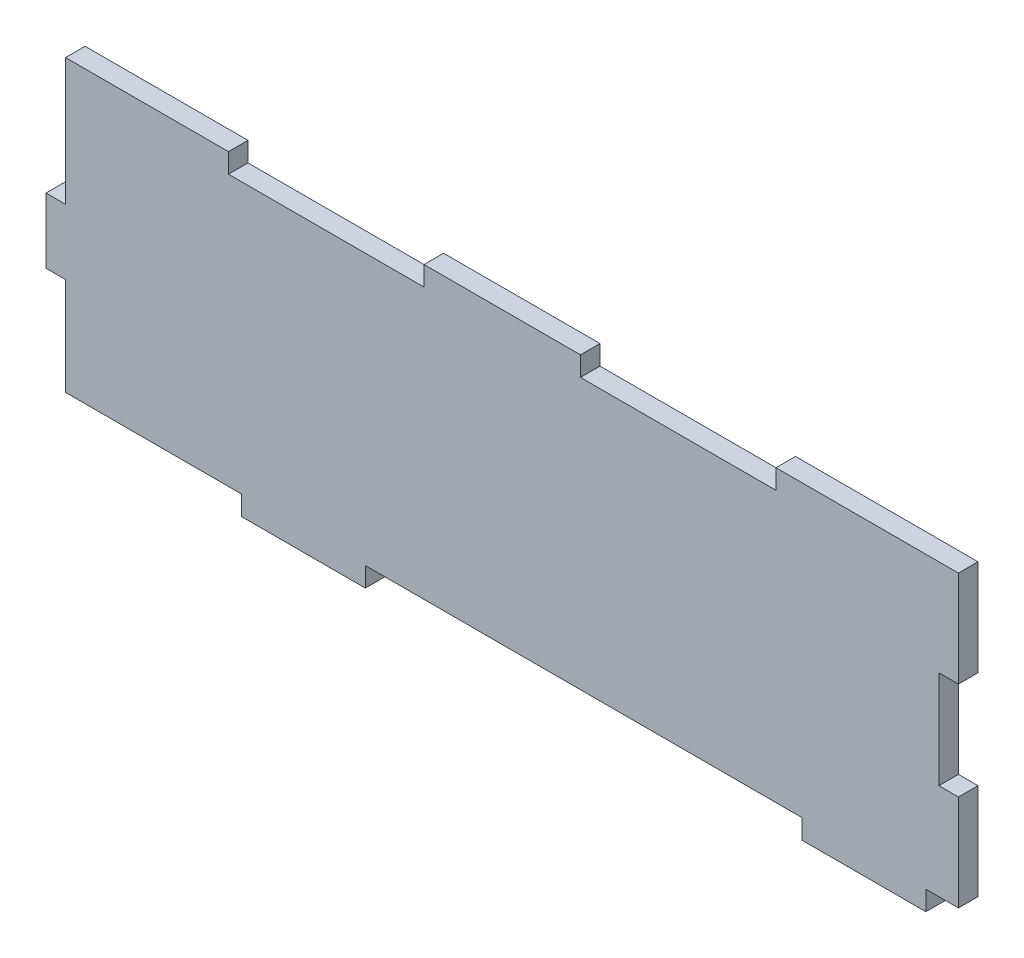
ISO-10303-21;
HEADER;
FILE_DESCRIPTION(('STEP AP214'),'2;1');
FILE_NAME('part.step','',(''),(''),'','','');
FILE_SCHEMA(('AUTOMOTIVE_DESIGN { 1 0 10303 214 1 1 1 1 }'));
ENDSEC;
DATA;
#1=APPLICATION_CONTEXT('core data for automotive mechanical design processes');
#2=APPLICATION_PROTOCOL_DEFINITION('international standard','automotive_design',2000,#1);
#3=PRODUCT_CONTEXT('',#1,'mechanical');
#4=PRODUCT('Part','Part','',(#3));
#5=PRODUCT_RELATED_PRODUCT_CATEGORY('part','',(#4));
#6=PRODUCT_DEFINITION_FORMATION('','',#4);
#7=PRODUCT_DEFINITION_CONTEXT('part definition',#1,'design');
#8=PRODUCT_DEFINITION('design','',#6,#7);
#9=PRODUCT_DEFINITION_SHAPE('','',#8);
#10=(LENGTH_UNIT() NAMED_UNIT(*) SI_UNIT(.MILLI.,.METRE.));
#11=(NAMED_UNIT(*) PLANE_ANGLE_UNIT() SI_UNIT($,.RADIAN.));
#12=(NAMED_UNIT(*) SI_UNIT($,.STERADIAN.) SOLID_ANGLE_UNIT());
#13=UNCERTAINTY_MEASURE_WITH_UNIT(LENGTH_MEASURE(1.E-05),#10,'distance_accuracy_value','');
#14=(GEOMETRIC_REPRESENTATION_CONTEXT(3) GLOBAL_UNCERTAINTY_ASSIGNED_CONTEXT((#13)) GLOBAL_UNIT_ASSIGNED_CONTEXT((#10,
#11,#12)) REPRESENTATION_CONTEXT('',''));
#15=CARTESIAN_POINT('',(0.,0.,0.));
#16=DIRECTION('',(0.,0.,1.));
#17=DIRECTION('',(1.,0.,0.));
#18=AXIS2_PLACEMENT_3D('',#15,#16,#17);
#19=CARTESIAN_POINT('',(-56.,145.,0.));
#20=DIRECTION('',(-1.,0.,0.));
#21=DIRECTION('',(0.,0.,1.));
#22=AXIS2_PLACEMENT_3D('',#19,#20,#21);
#23=PLANE('',#22);
#24=DIRECTION('',(0.,0.,-1.));
#25=VECTOR('',#24,1.);
#26=CARTESIAN_POINT('',(-56.,65.5,6.));
#27=LINE('',#26,#25);
#28=CARTESIAN_POINT('',(-56.,65.5,6.));
#29=VERTEX_POINT('',#28);
#30=CARTESIAN_POINT('',(-56.,65.5,0.));
#31=VERTEX_POINT('',#30);
#32=EDGE_CURVE('E240',#29,#31,#27,.T.);
#33=ORIENTED_EDGE('',*,*,#32,.F.);
#34=DIRECTION('',(0.,-1.,0.));
#35=VECTOR('',#34,1.);
#36=CARTESIAN_POINT('',(-56.,145.,6.));
#37=LINE('',#36,#35);
#38=CARTESIAN_POINT('',(-56.,35.5,6.));
#39=VERTEX_POINT('',#38);
#40=EDGE_CURVE('E39',#29,#39,#37,.T.);
#41=ORIENTED_EDGE('',*,*,#40,.T.);
#42=DIRECTION('',(0.,0.,1.));
#43=VECTOR('',#42,1.);
#44=CARTESIAN_POINT('',(-56.,35.5,6.));
#45=LINE('',#44,#43);
#46=CARTESIAN_POINT('',(-56.,35.5,0.));
#47=VERTEX_POINT('',#46);
#48=EDGE_CURVE('E246',#47,#39,#45,.T.);
#49=ORIENTED_EDGE('',*,*,#48,.F.);
#50=DIRECTION('',(0.,-1.,0.));
#51=VECTOR('',#50,1.);
#52=CARTESIAN_POINT('',(-56.,145.,0.));
#53=LINE('',#52,#51);
#54=EDGE_CURVE('E58',#31,#47,#53,.T.);
#55=ORIENTED_EDGE('',*,*,#54,.F.);
#56=EDGE_LOOP('',(#33,#41,#49,#55));
#57=FACE_BOUND('',#56,.T.);
#58=ADVANCED_FACE('F35',(#57),#23,.F.);
#59=CARTESIAN_POINT('',(0.,95.0000000000001,0.));
#60=DIRECTION('',(0.,1.,0.));
#61=DIRECTION('',(-1.,0.,0.));
#62=AXIS2_PLACEMENT_3D('',#59,#60,#61);
#63=PLANE('',#62);
#64=DIRECTION('',(0.,0.,1.));
#65=VECTOR('',#64,1.);
#66=CARTESIAN_POINT('',(-214.,95.,0.));
#67=LINE('',#66,#65);
#68=CARTESIAN_POINT('',(-214.,95.,0.));
#69=VERTEX_POINT('',#68);
#70=CARTESIAN_POINT('',(-214.,95.,6.));
#71=VERTEX_POINT('',#70);
#72=EDGE_CURVE('E466',#69,#71,#67,.T.);
#73=ORIENTED_EDGE('',*,*,#72,.T.);
#74=DIRECTION('',(1.,0.,0.));
#75=VECTOR('',#74,1.);
#76=CARTESIAN_POINT('',(-56.,95.,6.));
#77=LINE('',#76,#75);
#78=CARTESIAN_POINT('',(-166.,95.,6.));
#79=VERTEX_POINT('',#78);
#80=EDGE_CURVE('E300',#71,#79,#77,.T.);
#81=ORIENTED_EDGE('',*,*,#80,.T.);
#82=DIRECTION('',(0.,0.,1.));
#83=VECTOR('',#82,1.);
#84=CARTESIAN_POINT('',(-166.,95.,0.));
#85=LINE('',#84,#83);
#86=CARTESIAN_POINT('',(-166.,95.,0.));
#87=VERTEX_POINT('',#86);
#88=EDGE_CURVE('E489',#87,#79,#85,.T.);
#89=ORIENTED_EDGE('',*,*,#88,.F.);
#90=DIRECTION('',(-1.,0.,0.));
#91=VECTOR('',#90,1.);
#92=CARTESIAN_POINT('',(-56.,95.,0.));
#93=LINE('',#92,#91);
#94=EDGE_CURVE('E292',#87,#69,#93,.T.);
#95=ORIENTED_EDGE('',*,*,#94,.T.);
#96=EDGE_LOOP('',(#73,#81,#89,#95));
#97=FACE_BOUND('',#96,.T.);
#98=ADVANCED_FACE('F503',(#97),#63,.T.);
#99=DIRECTION('',(0.,0.,1.));
#100=VECTOR('',#99,1.);
#101=CARTESIAN_POINT('',(-106.,95.,0.));
#102=LINE('',#101,#100);
#103=CARTESIAN_POINT('',(-106.,95.,0.));
#104=VERTEX_POINT('',#103);
#105=CARTESIAN_POINT('',(-106.,95.,6.));
#106=VERTEX_POINT('',#105);
#107=EDGE_CURVE('E284',#104,#106,#102,.T.);
#108=ORIENTED_EDGE('',*,*,#107,.T.);
#109=CARTESIAN_POINT('',(-50.,95.,6.));
#110=VERTEX_POINT('',#109);
#111=EDGE_CURVE('E295',#106,#110,#77,.T.);
#112=ORIENTED_EDGE('',*,*,#111,.T.);
#113=DIRECTION('',(0.,0.,1.));
#114=VECTOR('',#113,1.);
#115=CARTESIAN_POINT('',(-50.,95.,6.));
#116=LINE('',#115,#114);
#117=CARTESIAN_POINT('',(-50.,95.,0.));
#118=VERTEX_POINT('',#117);
#119=EDGE_CURVE('E237',#118,#110,#116,.T.);
#120=ORIENTED_EDGE('',*,*,#119,.F.);
#121=EDGE_CURVE('E288',#118,#104,#93,.T.);
#122=ORIENTED_EDGE('',*,*,#121,.T.);
#123=EDGE_LOOP('',(#108,#112,#120,#122));
#124=FACE_BOUND('',#123,.T.);
#125=ADVANCED_FACE('F496',(#124),#63,.T.);
#126=CARTESIAN_POINT('',(0.,0.,6.));
#127=DIRECTION('',(0.,1.,0.));
#128=DIRECTION('',(0.,0.,1.));
#129=AXIS2_PLACEMENT_3D('',#126,#127,#128);
#130=PLANE('',#129);
#131=DIRECTION('',(1.,0.,0.));
#132=VECTOR('',#131,1.);
#133=CARTESIAN_POINT('',(0.,0.,0.));
#134=LINE('',#133,#132);
#135=CARTESIAN_POINT('',(-270.,0.,0.));
#136=VERTEX_POINT('',#135);
#137=CARTESIAN_POINT('',(-232.,0.,0.));
#138=VERTEX_POINT('',#137);
#139=EDGE_CURVE('E270',#136,#138,#134,.T.);
#140=ORIENTED_EDGE('',*,*,#139,.T.);
#141=DIRECTION('',(0.,0.,1.));
#142=VECTOR('',#141,1.);
#143=CARTESIAN_POINT('',(-232.,0.,0.));
#144=LINE('',#143,#142);
#145=CARTESIAN_POINT('',(-232.,0.,6.));
#146=VERTEX_POINT('',#145);
#147=EDGE_CURVE('E326',#138,#146,#144,.T.);
#148=ORIENTED_EDGE('',*,*,#147,.T.);
#149=DIRECTION('',(1.,0.,0.));
#150=VECTOR('',#149,1.);
#151=CARTESIAN_POINT('',(0.,0.,6.));
#152=LINE('',#151,#150);
#153=CARTESIAN_POINT('',(-270.,0.,6.));
#154=VERTEX_POINT('',#153);
#155=EDGE_CURVE('E11',#154,#146,#152,.T.);
#156=ORIENTED_EDGE('',*,*,#155,.F.);
#157=DIRECTION('',(0.,0.,1.));
#158=VECTOR('',#157,1.);
#159=CARTESIAN_POINT('',(-270.,0.,0.));
#160=LINE('',#159,#158);
#161=EDGE_CURVE('E371',#136,#154,#160,.T.);
#162=ORIENTED_EDGE('',*,*,#161,.F.);
#163=EDGE_LOOP('',(#140,#148,#156,#162));
#164=FACE_BOUND('',#163,.T.);
#165=ADVANCED_FACE('F407',(#164),#130,.F.);
#166=CARTESIAN_POINT('',(-330.,0.,6.));
#167=DIRECTION('',(1.,0.,0.));
#168=DIRECTION('',(0.,0.,-1.));
#169=AXIS2_PLACEMENT_3D('',#166,#167,#168);
#170=PLANE('',#169);
#171=DIRECTION('',(0.,-1.,0.));
#172=VECTOR('',#171,1.);
#173=CARTESIAN_POINT('',(-330.,0.,6.));
#174=LINE('',#173,#172);
#175=CARTESIAN_POINT('',(-330.,56.,6.));
#176=VERTEX_POINT('',#175);
#177=CARTESIAN_POINT('',(-330.,36.,6.));
#178=VERTEX_POINT('',#177);
#179=EDGE_CURVE('E393',#176,#178,#174,.T.);
#180=ORIENTED_EDGE('',*,*,#179,.F.);
#181=DIRECTION('',(0.,0.,1.));
#182=VECTOR('',#181,1.);
#183=CARTESIAN_POINT('',(-330.,56.,0.));
#184=LINE('',#183,#182);
#185=CARTESIAN_POINT('',(-330.,56.,0.));
#186=VERTEX_POINT('',#185);
#187=EDGE_CURVE('E308',#186,#176,#184,.T.);
#188=ORIENTED_EDGE('',*,*,#187,.F.);
#189=DIRECTION('',(0.,-1.,0.));
#190=VECTOR('',#189,1.);
#191=CARTESIAN_POINT('',(-330.,0.,0.));
#192=LINE('',#191,#190);
#193=CARTESIAN_POINT('',(-330.,36.,0.));
#194=VERTEX_POINT('',#193);
#195=EDGE_CURVE('E385',#186,#194,#192,.T.);
#196=ORIENTED_EDGE('',*,*,#195,.T.);
#197=DIRECTION('',(0.,0.,1.));
#198=VECTOR('',#197,1.);
#199=CARTESIAN_POINT('',(-330.,36.,0.));
#200=LINE('',#199,#198);
#201=EDGE_CURVE('E382',#194,#178,#200,.T.);
#202=ORIENTED_EDGE('',*,*,#201,.T.);
#203=EDGE_LOOP('',(#180,#188,#196,#202));
#204=FACE_BOUND('',#203,.T.);
#205=ADVANCED_FACE('F37',(#204),#170,.F.);
#206=CARTESIAN_POINT('',(-98.,0.,6.));
#207=VERTEX_POINT('',#206);
#208=CARTESIAN_POINT('',(-60.,0.,6.));
#209=VERTEX_POINT('',#208);
#210=EDGE_CURVE('E45',#207,#209,#152,.T.);
#211=ORIENTED_EDGE('',*,*,#210,.F.);
#212=DIRECTION('',(0.,0.,1.));
#213=VECTOR('',#212,1.);
#214=CARTESIAN_POINT('',(-98.,0.,0.));
#215=LINE('',#214,#213);
#216=CARTESIAN_POINT('',(-98.,0.,0.));
#217=VERTEX_POINT('',#216);
#218=EDGE_CURVE('E338',#217,#207,#215,.T.);
#219=ORIENTED_EDGE('',*,*,#218,.F.);
#220=CARTESIAN_POINT('',(-60.,0.,0.));
#221=VERTEX_POINT('',#220);
#222=EDGE_CURVE('E394',#217,#221,#134,.T.);
#223=ORIENTED_EDGE('',*,*,#222,.T.);
#224=DIRECTION('',(0.,0.,1.));
#225=VECTOR('',#224,1.);
#226=CARTESIAN_POINT('',(-60.,0.,0.));
#227=LINE('',#226,#225);
#228=EDGE_CURVE('E352',#221,#209,#227,.T.);
#229=ORIENTED_EDGE('',*,*,#228,.T.);
#230=EDGE_LOOP('',(#211,#219,#223,#229));
#231=FACE_BOUND('',#230,.T.);
#232=ADVANCED_FACE('F574',(#231),#130,.F.);
#233=CARTESIAN_POINT('',(0.,0.,6.));
#234=DIRECTION('',(0.,0.,1.));
#235=DIRECTION('',(1.,0.,0.));
#236=AXIS2_PLACEMENT_3D('',#233,#234,#235);
#237=PLANE('',#236);
#238=DIRECTION('',(0.,1.,0.));
#239=VECTOR('',#238,1.);
#240=CARTESIAN_POINT('',(-214.,95.,6.));
#241=LINE('',#240,#239);
#242=CARTESIAN_POINT('',(-214.,89.,6.));
#243=VERTEX_POINT('',#242);
#244=EDGE_CURVE('E278',#243,#71,#241,.T.);
#245=ORIENTED_EDGE('',*,*,#244,.F.);
#246=DIRECTION('',(1.,0.,0.));
#247=VECTOR('',#246,1.);
#248=CARTESIAN_POINT('',(-214.,89.,6.));
#249=LINE('',#248,#247);
#250=CARTESIAN_POINT('',(-274.,89.,6.));
#251=VERTEX_POINT('',#250);
#252=EDGE_CURVE('E452',#251,#243,#249,.T.);
#253=ORIENTED_EDGE('',*,*,#252,.F.);
#254=DIRECTION('',(0.,-1.,0.));
#255=VECTOR('',#254,1.);
#256=CARTESIAN_POINT('',(-274.,95.,6.));
#257=LINE('',#256,#255);
#258=CARTESIAN_POINT('',(-274.,95.,6.));
#259=VERTEX_POINT('',#258);
#260=EDGE_CURVE('E450',#259,#251,#257,.T.);
#261=ORIENTED_EDGE('',*,*,#260,.F.);
#262=CARTESIAN_POINT('',(-324.,95.,6.));
#263=VERTEX_POINT('',#262);
#264=EDGE_CURVE('E296',#263,#259,#77,.T.);
#265=ORIENTED_EDGE('',*,*,#264,.F.);
#266=DIRECTION('',(0.,1.,0.));
#267=VECTOR('',#266,1.);
#268=CARTESIAN_POINT('',(-324.,75.0000000000001,6.));
#269=LINE('',#268,#267);
#270=CARTESIAN_POINT('',(-324.,56.,6.));
#271=VERTEX_POINT('',#270);
#272=EDGE_CURVE('E305',#271,#263,#269,.T.);
#273=ORIENTED_EDGE('',*,*,#272,.F.);
#274=DIRECTION('',(1.,0.,0.));
#275=VECTOR('',#274,1.);
#276=CARTESIAN_POINT('',(-330.,56.,6.));
#277=LINE('',#276,#275);
#278=EDGE_CURVE('E299',#176,#271,#277,.T.);
#279=ORIENTED_EDGE('',*,*,#278,.F.);
#280=ORIENTED_EDGE('',*,*,#179,.T.);
#281=DIRECTION('',(-1.,0.,0.));
#282=VECTOR('',#281,1.);
#283=CARTESIAN_POINT('',(-330.,36.,6.));
#284=LINE('',#283,#282);
#285=CARTESIAN_POINT('',(-324.,36.,6.));
#286=VERTEX_POINT('',#285);
#287=EDGE_CURVE('E362',#286,#178,#284,.T.);
#288=ORIENTED_EDGE('',*,*,#287,.F.);
#289=DIRECTION('',(0.,1.,0.));
#290=VECTOR('',#289,1.);
#291=CARTESIAN_POINT('',(-324.,6.,6.));
#292=LINE('',#291,#290);
#293=CARTESIAN_POINT('',(-324.,6.,6.));
#294=VERTEX_POINT('',#293);
#295=EDGE_CURVE('E377',#294,#286,#292,.T.);
#296=ORIENTED_EDGE('',*,*,#295,.F.);
#297=DIRECTION('',(-1.,0.,0.));
#298=VECTOR('',#297,1.);
#299=CARTESIAN_POINT('',(-324.,6.,6.));
#300=LINE('',#299,#298);
#301=CARTESIAN_POINT('',(-270.,6.,6.));
#302=VERTEX_POINT('',#301);
#303=EDGE_CURVE('E374',#302,#294,#300,.T.);
#304=ORIENTED_EDGE('',*,*,#303,.F.);
#305=DIRECTION('',(0.,1.,0.));
#306=VECTOR('',#305,1.);
#307=CARTESIAN_POINT('',(-270.,0.,6.));
#308=LINE('',#307,#306);
#309=EDGE_CURVE('E355',#154,#302,#308,.T.);
#310=ORIENTED_EDGE('',*,*,#309,.F.);
#311=ORIENTED_EDGE('',*,*,#155,.T.);
#312=DIRECTION('',(0.,-1.,0.));
#313=VECTOR('',#312,1.);
#314=CARTESIAN_POINT('',(-232.,0.,6.));
#315=LINE('',#314,#313);
#316=CARTESIAN_POINT('',(-232.,6.,6.));
#317=VERTEX_POINT('',#316);
#318=EDGE_CURVE('E314',#317,#146,#315,.T.);
#319=ORIENTED_EDGE('',*,*,#318,.F.);
#320=DIRECTION('',(-1.,0.,0.));
#321=VECTOR('',#320,1.);
#322=CARTESIAN_POINT('',(-232.,6.,6.));
#323=LINE('',#322,#321);
#324=CARTESIAN_POINT('',(-98.,6.,6.));
#325=VERTEX_POINT('',#324);
#326=EDGE_CURVE('E320',#325,#317,#323,.T.);
#327=ORIENTED_EDGE('',*,*,#326,.F.);
#328=DIRECTION('',(0.,1.,0.));
#329=VECTOR('',#328,1.);
#330=CARTESIAN_POINT('',(-98.,0.,6.));
#331=LINE('',#330,#329);
#332=EDGE_CURVE('E328',#207,#325,#331,.T.);
#333=ORIENTED_EDGE('',*,*,#332,.F.);
#334=ORIENTED_EDGE('',*,*,#210,.T.);
#335=DIRECTION('',(0.,-1.,0.));
#336=VECTOR('',#335,1.);
#337=CARTESIAN_POINT('',(-60.,0.,6.));
#338=LINE('',#337,#336);
#339=CARTESIAN_POINT('',(-60.,5.99999999999999,6.));
#340=VERTEX_POINT('',#339);
#341=EDGE_CURVE('E345',#340,#209,#338,.T.);
#342=ORIENTED_EDGE('',*,*,#341,.F.);
#343=DIRECTION('',(-1.,0.,0.));
#344=VECTOR('',#343,1.);
#345=CARTESIAN_POINT('',(-6.,6.,6.));
#346=LINE('',#345,#344);
#347=CARTESIAN_POINT('',(-50.,6.00000000000001,6.));
#348=VERTEX_POINT('',#347);
#349=EDGE_CURVE('E335',#348,#340,#346,.T.);
#350=ORIENTED_EDGE('',*,*,#349,.F.);
#351=DIRECTION('',(0.,-1.,0.));
#352=VECTOR('',#351,1.);
#353=CARTESIAN_POINT('',(-50.,6.00000000000001,6.));
#354=LINE('',#353,#352);
#355=CARTESIAN_POINT('',(-50.,35.5,6.));
#356=VERTEX_POINT('',#355);
#357=EDGE_CURVE('E249',#356,#348,#354,.T.);
#358=ORIENTED_EDGE('',*,*,#357,.F.);
#359=DIRECTION('',(-1.,0.,0.));
#360=VECTOR('',#359,1.);
#361=CARTESIAN_POINT('',(-50.,35.5,6.));
#362=LINE('',#361,#360);
#363=EDGE_CURVE('E263',#356,#39,#362,.T.);
#364=ORIENTED_EDGE('',*,*,#363,.T.);
#365=ORIENTED_EDGE('',*,*,#40,.F.);
#366=DIRECTION('',(-1.,0.,0.));
#367=VECTOR('',#366,1.);
#368=CARTESIAN_POINT('',(-50.,65.5,6.));
#369=LINE('',#368,#367);
#370=CARTESIAN_POINT('',(-50.,65.5,6.));
#371=VERTEX_POINT('',#370);
#372=EDGE_CURVE('E226',#371,#29,#369,.T.);
#373=ORIENTED_EDGE('',*,*,#372,.F.);
#374=DIRECTION('',(0.,-1.,0.));
#375=VECTOR('',#374,1.);
#376=CARTESIAN_POINT('',(-50.,95.,6.));
#377=LINE('',#376,#375);
#378=EDGE_CURVE('E231',#110,#371,#377,.T.);
#379=ORIENTED_EDGE('',*,*,#378,.F.);
#380=ORIENTED_EDGE('',*,*,#111,.F.);
#381=DIRECTION('',(0.,1.,0.));
#382=VECTOR('',#381,1.);
#383=CARTESIAN_POINT('',(-106.,95.,6.));
#384=LINE('',#383,#382);
#385=CARTESIAN_POINT('',(-106.,89.,6.));
#386=VERTEX_POINT('',#385);
#387=EDGE_CURVE('E461',#386,#106,#384,.T.);
#388=ORIENTED_EDGE('',*,*,#387,.F.);
#389=DIRECTION('',(1.,0.,0.));
#390=VECTOR('',#389,1.);
#391=CARTESIAN_POINT('',(-106.,89.,6.));
#392=LINE('',#391,#390);
#393=CARTESIAN_POINT('',(-166.,89.,6.));
#394=VERTEX_POINT('',#393);
#395=EDGE_CURVE('E474',#394,#386,#392,.T.);
#396=ORIENTED_EDGE('',*,*,#395,.F.);
#397=DIRECTION('',(0.,-1.,0.));
#398=VECTOR('',#397,1.);
#399=CARTESIAN_POINT('',(-166.,95.,6.));
#400=LINE('',#399,#398);
#401=EDGE_CURVE('E481',#79,#394,#400,.T.);
#402=ORIENTED_EDGE('',*,*,#401,.F.);
#403=ORIENTED_EDGE('',*,*,#80,.F.);
#404=EDGE_LOOP('',(#245,#253,#261,#265,#273,#279,#280,#288,#296,#304,#310,#311,#319,#327,#333,
#334,#342,#350,#358,#364,#365,#373,#379,#380,#388,#396,#402,#403));
#405=FACE_BOUND('',#404,.T.);
#406=ADVANCED_FACE('F244',(#405),#237,.T.);
#407=CARTESIAN_POINT('',(0.,0.,0.));
#408=DIRECTION('',(0.,0.,1.));
#409=DIRECTION('',(1.,0.,0.));
#410=AXIS2_PLACEMENT_3D('',#407,#408,#409);
#411=PLANE('',#410);
#412=DIRECTION('',(1.,0.,0.));
#413=VECTOR('',#412,1.);
#414=CARTESIAN_POINT('',(-214.,89.,0.));
#415=LINE('',#414,#413);
#416=CARTESIAN_POINT('',(-274.,89.,0.));
#417=VERTEX_POINT('',#416);
#418=CARTESIAN_POINT('',(-214.,89.,0.));
#419=VERTEX_POINT('',#418);
#420=EDGE_CURVE('E469',#417,#419,#415,.T.);
#421=ORIENTED_EDGE('',*,*,#420,.T.);
#422=DIRECTION('',(0.,1.,0.));
#423=VECTOR('',#422,1.);
#424=CARTESIAN_POINT('',(-214.,95.,0.));
#425=LINE('',#424,#423);
#426=EDGE_CURVE('E266',#419,#69,#425,.T.);
#427=ORIENTED_EDGE('',*,*,#426,.T.);
#428=ORIENTED_EDGE('',*,*,#94,.F.);
#429=DIRECTION('',(0.,-1.,0.));
#430=VECTOR('',#429,1.);
#431=CARTESIAN_POINT('',(-166.,95.,0.));
#432=LINE('',#431,#430);
#433=CARTESIAN_POINT('',(-166.,89.,0.));
#434=VERTEX_POINT('',#433);
#435=EDGE_CURVE('E473',#87,#434,#432,.T.);
#436=ORIENTED_EDGE('',*,*,#435,.T.);
#437=DIRECTION('',(1.,0.,0.));
#438=VECTOR('',#437,1.);
#439=CARTESIAN_POINT('',(-106.,89.,0.));
#440=LINE('',#439,#438);
#441=CARTESIAN_POINT('',(-106.,89.,0.));
#442=VERTEX_POINT('',#441);
#443=EDGE_CURVE('E477',#434,#442,#440,.T.);
#444=ORIENTED_EDGE('',*,*,#443,.T.);
#445=DIRECTION('',(0.,1.,0.));
#446=VECTOR('',#445,1.);
#447=CARTESIAN_POINT('',(-106.,95.,0.));
#448=LINE('',#447,#446);
#449=EDGE_CURVE('E470',#442,#104,#448,.T.);
#450=ORIENTED_EDGE('',*,*,#449,.T.);
#451=ORIENTED_EDGE('',*,*,#121,.F.);
#452=DIRECTION('',(0.,1.,0.));
#453=VECTOR('',#452,1.);
#454=CARTESIAN_POINT('',(-50.,95.,0.));
#455=LINE('',#454,#453);
#456=CARTESIAN_POINT('',(-50.,65.5,0.));
#457=VERTEX_POINT('',#456);
#458=EDGE_CURVE('E230',#457,#118,#455,.T.);
#459=ORIENTED_EDGE('',*,*,#458,.F.);
#460=DIRECTION('',(-1.,0.,0.));
#461=VECTOR('',#460,1.);
#462=CARTESIAN_POINT('',(-50.,65.5,0.));
#463=LINE('',#462,#461);
#464=EDGE_CURVE('E53',#457,#31,#463,.T.);
#465=ORIENTED_EDGE('',*,*,#464,.T.);
#466=ORIENTED_EDGE('',*,*,#54,.T.);
#467=DIRECTION('',(-1.,0.,0.));
#468=VECTOR('',#467,1.);
#469=CARTESIAN_POINT('',(-50.,35.5,0.));
#470=LINE('',#469,#468);
#471=CARTESIAN_POINT('',(-50.,35.5,0.));
#472=VERTEX_POINT('',#471);
#473=EDGE_CURVE('E273',#472,#47,#470,.T.);
#474=ORIENTED_EDGE('',*,*,#473,.F.);
#475=DIRECTION('',(0.,1.,0.));
#476=VECTOR('',#475,1.);
#477=CARTESIAN_POINT('',(-50.,6.00000000000001,0.));
#478=LINE('',#477,#476);
#479=CARTESIAN_POINT('',(-50.,6.00000000000001,0.));
#480=VERTEX_POINT('',#479);
#481=EDGE_CURVE('E259',#480,#472,#478,.T.);
#482=ORIENTED_EDGE('',*,*,#481,.F.);
#483=DIRECTION('',(-1.,0.,0.));
#484=VECTOR('',#483,1.);
#485=CARTESIAN_POINT('',(-6.,6.,0.));
#486=LINE('',#485,#484);
#487=CARTESIAN_POINT('',(-60.,5.99999999999999,0.));
#488=VERTEX_POINT('',#487);
#489=EDGE_CURVE('E342',#480,#488,#486,.T.);
#490=ORIENTED_EDGE('',*,*,#489,.T.);
#491=DIRECTION('',(0.,-1.,0.));
#492=VECTOR('',#491,1.);
#493=CARTESIAN_POINT('',(-60.,0.,0.));
#494=LINE('',#493,#492);
#495=EDGE_CURVE('E344',#488,#221,#494,.T.);
#496=ORIENTED_EDGE('',*,*,#495,.T.);
#497=ORIENTED_EDGE('',*,*,#222,.F.);
#498=DIRECTION('',(0.,1.,0.));
#499=VECTOR('',#498,1.);
#500=CARTESIAN_POINT('',(-98.,0.,0.));
#501=LINE('',#500,#499);
#502=CARTESIAN_POINT('',(-98.,6.,0.));
#503=VERTEX_POINT('',#502);
#504=EDGE_CURVE('E319',#217,#503,#501,.T.);
#505=ORIENTED_EDGE('',*,*,#504,.T.);
#506=DIRECTION('',(-1.,0.,0.));
#507=VECTOR('',#506,1.);
#508=CARTESIAN_POINT('',(-232.,6.,0.));
#509=LINE('',#508,#507);
#510=CARTESIAN_POINT('',(-232.,6.,0.));
#511=VERTEX_POINT('',#510);
#512=EDGE_CURVE('E323',#503,#511,#509,.T.);
#513=ORIENTED_EDGE('',*,*,#512,.T.);
#514=DIRECTION('',(0.,-1.,0.));
#515=VECTOR('',#514,1.);
#516=CARTESIAN_POINT('',(-232.,0.,0.));
#517=LINE('',#516,#515);
#518=EDGE_CURVE('E316',#511,#138,#517,.T.);
#519=ORIENTED_EDGE('',*,*,#518,.T.);
#520=ORIENTED_EDGE('',*,*,#139,.F.);
#521=DIRECTION('',(0.,1.,0.));
#522=VECTOR('',#521,1.);
#523=CARTESIAN_POINT('',(-270.,0.,0.));
#524=LINE('',#523,#522);
#525=CARTESIAN_POINT('',(-270.,6.,0.));
#526=VERTEX_POINT('',#525);
#527=EDGE_CURVE('E358',#136,#526,#524,.T.);
#528=ORIENTED_EDGE('',*,*,#527,.T.);
#529=DIRECTION('',(-1.,0.,0.));
#530=VECTOR('',#529,1.);
#531=CARTESIAN_POINT('',(-324.,6.,0.));
#532=LINE('',#531,#530);
#533=CARTESIAN_POINT('',(-324.,6.,0.));
#534=VERTEX_POINT('',#533);
#535=EDGE_CURVE('E361',#526,#534,#532,.T.);
#536=ORIENTED_EDGE('',*,*,#535,.T.);
#537=DIRECTION('',(0.,1.,0.));
#538=VECTOR('',#537,1.);
#539=CARTESIAN_POINT('',(-324.,6.,0.));
#540=LINE('',#539,#538);
#541=CARTESIAN_POINT('',(-324.,36.,0.));
#542=VERTEX_POINT('',#541);
#543=EDGE_CURVE('E365',#534,#542,#540,.T.);
#544=ORIENTED_EDGE('',*,*,#543,.T.);
#545=DIRECTION('',(-1.,0.,0.));
#546=VECTOR('',#545,1.);
#547=CARTESIAN_POINT('',(-330.,36.,0.));
#548=LINE('',#547,#546);
#549=EDGE_CURVE('E368',#542,#194,#548,.T.);
#550=ORIENTED_EDGE('',*,*,#549,.T.);
#551=ORIENTED_EDGE('',*,*,#195,.F.);
#552=DIRECTION('',(1.,0.,0.));
#553=VECTOR('',#552,1.);
#554=CARTESIAN_POINT('',(-330.,56.,0.));
#555=LINE('',#554,#553);
#556=CARTESIAN_POINT('',(-324.,56.,0.));
#557=VERTEX_POINT('',#556);
#558=EDGE_CURVE('E301',#186,#557,#555,.T.);
#559=ORIENTED_EDGE('',*,*,#558,.T.);
#560=DIRECTION('',(0.,1.,0.));
#561=VECTOR('',#560,1.);
#562=CARTESIAN_POINT('',(-324.,75.0000000000001,0.));
#563=LINE('',#562,#561);
#564=CARTESIAN_POINT('',(-324.,95.,0.));
#565=VERTEX_POINT('',#564);
#566=EDGE_CURVE('E304',#557,#565,#563,.T.);
#567=ORIENTED_EDGE('',*,*,#566,.T.);
#568=CARTESIAN_POINT('',(-274.,95.,0.));
#569=VERTEX_POINT('',#568);
#570=EDGE_CURVE('E281',#569,#565,#93,.T.);
#571=ORIENTED_EDGE('',*,*,#570,.F.);
#572=DIRECTION('',(0.,-1.,0.));
#573=VECTOR('',#572,1.);
#574=CARTESIAN_POINT('',(-274.,95.,0.));
#575=LINE('',#574,#573);
#576=EDGE_CURVE('E514',#569,#417,#575,.T.);
#577=ORIENTED_EDGE('',*,*,#576,.T.);
#578=EDGE_LOOP('',(#421,#427,#428,#436,#444,#450,#451,#459,#465,#466,#474,#482,#490,#496,#497,
#505,#513,#519,#520,#528,#536,#544,#550,#551,#559,#567,#571,#577));
#579=FACE_BOUND('',#578,.T.);
#580=ADVANCED_FACE('F410',(#579),#411,.F.);
#581=CARTESIAN_POINT('',(-330.,36.,0.));
#582=DIRECTION('',(0.,1.,0.));
#583=DIRECTION('',(0.,0.,1.));
#584=AXIS2_PLACEMENT_3D('',#581,#582,#583);
#585=PLANE('',#584);
#586=ORIENTED_EDGE('',*,*,#287,.T.);
#587=ORIENTED_EDGE('',*,*,#201,.F.);
#588=ORIENTED_EDGE('',*,*,#549,.F.);
#589=DIRECTION('',(0.,0.,1.));
#590=VECTOR('',#589,1.);
#591=CARTESIAN_POINT('',(-324.,36.,0.));
#592=LINE('',#591,#590);
#593=EDGE_CURVE('E386',#542,#286,#592,.T.);
#594=ORIENTED_EDGE('',*,*,#593,.T.);
#595=EDGE_LOOP('',(#586,#587,#588,#594));
#596=FACE_BOUND('',#595,.T.);
#597=ADVANCED_FACE('F431',(#596),#585,.F.);
#598=CARTESIAN_POINT('',(-324.,6.,0.));
#599=DIRECTION('',(1.,0.,0.));
#600=DIRECTION('',(0.,0.,-1.));
#601=AXIS2_PLACEMENT_3D('',#598,#599,#600);
#602=PLANE('',#601);
#603=ORIENTED_EDGE('',*,*,#295,.T.);
#604=ORIENTED_EDGE('',*,*,#593,.F.);
#605=ORIENTED_EDGE('',*,*,#543,.F.);
#606=DIRECTION('',(0.,0.,1.));
#607=VECTOR('',#606,1.);
#608=CARTESIAN_POINT('',(-324.,6.,0.));
#609=LINE('',#608,#607);
#610=EDGE_CURVE('E388',#534,#294,#609,.T.);
#611=ORIENTED_EDGE('',*,*,#610,.T.);
#612=EDGE_LOOP('',(#603,#604,#605,#611));
#613=FACE_BOUND('',#612,.T.);
#614=ADVANCED_FACE('F428',(#613),#602,.F.);
#615=CARTESIAN_POINT('',(-324.,6.,0.));
#616=DIRECTION('',(0.,1.,0.));
#617=DIRECTION('',(0.,0.,1.));
#618=AXIS2_PLACEMENT_3D('',#615,#616,#617);
#619=PLANE('',#618);
#620=ORIENTED_EDGE('',*,*,#303,.T.);
#621=ORIENTED_EDGE('',*,*,#610,.F.);
#622=ORIENTED_EDGE('',*,*,#535,.F.);
#623=DIRECTION('',(0.,0.,1.));
#624=VECTOR('',#623,1.);
#625=CARTESIAN_POINT('',(-270.,6.,0.));
#626=LINE('',#625,#624);
#627=EDGE_CURVE('E390',#526,#302,#626,.T.);
#628=ORIENTED_EDGE('',*,*,#627,.T.);
#629=EDGE_LOOP('',(#620,#621,#622,#628));
#630=FACE_BOUND('',#629,.T.);
#631=ADVANCED_FACE('F424',(#630),#619,.F.);
#632=CARTESIAN_POINT('',(-270.,0.,0.));
#633=DIRECTION('',(1.,0.,0.));
#634=DIRECTION('',(0.,0.,-1.));
#635=AXIS2_PLACEMENT_3D('',#632,#633,#634);
#636=PLANE('',#635);
#637=ORIENTED_EDGE('',*,*,#309,.T.);
#638=ORIENTED_EDGE('',*,*,#627,.F.);
#639=ORIENTED_EDGE('',*,*,#527,.F.);
#640=ORIENTED_EDGE('',*,*,#161,.T.);
#641=EDGE_LOOP('',(#637,#638,#639,#640));
#642=FACE_BOUND('',#641,.T.);
#643=ADVANCED_FACE('F422',(#642),#636,.F.);
#644=CARTESIAN_POINT('',(-60.,0.,0.));
#645=DIRECTION('',(-1.,0.,0.));
#646=DIRECTION('',(0.,0.,1.));
#647=AXIS2_PLACEMENT_3D('',#644,#645,#646);
#648=PLANE('',#647);
#649=ORIENTED_EDGE('',*,*,#341,.T.);
#650=ORIENTED_EDGE('',*,*,#228,.F.);
#651=ORIENTED_EDGE('',*,*,#495,.F.);
#652=DIRECTION('',(0.,0.,1.));
#653=VECTOR('',#652,1.);
#654=CARTESIAN_POINT('',(-60.,5.99999999999999,0.));
#655=LINE('',#654,#653);
#656=EDGE_CURVE('E348',#488,#340,#655,.T.);
#657=ORIENTED_EDGE('',*,*,#656,.T.);
#658=EDGE_LOOP('',(#649,#650,#651,#657));
#659=FACE_BOUND('',#658,.T.);
#660=ADVANCED_FACE('F557',(#659),#648,.F.);
#661=CARTESIAN_POINT('',(-6.,6.,0.));
#662=DIRECTION('',(0.,1.,0.));
#663=DIRECTION('',(-1.,0.,0.));
#664=AXIS2_PLACEMENT_3D('',#661,#662,#663);
#665=PLANE('',#664);
#666=ORIENTED_EDGE('',*,*,#489,.F.);
#667=DIRECTION('',(0.,0.,-1.));
#668=VECTOR('',#667,1.);
#669=CARTESIAN_POINT('',(-50.,6.00000000000001,6.));
#670=LINE('',#669,#668);
#671=EDGE_CURVE('E256',#348,#480,#670,.T.);
#672=ORIENTED_EDGE('',*,*,#671,.F.);
#673=ORIENTED_EDGE('',*,*,#349,.T.);
#674=ORIENTED_EDGE('',*,*,#656,.F.);
#675=EDGE_LOOP('',(#666,#672,#673,#674));
#676=FACE_BOUND('',#675,.T.);
#677=ADVANCED_FACE('F556',(#676),#665,.F.);
#678=CARTESIAN_POINT('',(-232.,0.,0.));
#679=DIRECTION('',(-1.,0.,0.));
#680=DIRECTION('',(0.,0.,1.));
#681=AXIS2_PLACEMENT_3D('',#678,#679,#680);
#682=PLANE('',#681);
#683=ORIENTED_EDGE('',*,*,#318,.T.);
#684=ORIENTED_EDGE('',*,*,#147,.F.);
#685=ORIENTED_EDGE('',*,*,#518,.F.);
#686=DIRECTION('',(0.,0.,1.));
#687=VECTOR('',#686,1.);
#688=CARTESIAN_POINT('',(-232.,6.,0.));
#689=LINE('',#688,#687);
#690=EDGE_CURVE('E333',#511,#317,#689,.T.);
#691=ORIENTED_EDGE('',*,*,#690,.T.);
#692=EDGE_LOOP('',(#683,#684,#685,#691));
#693=FACE_BOUND('',#692,.T.);
#694=ADVANCED_FACE('F413',(#693),#682,.F.);
#695=CARTESIAN_POINT('',(-232.,6.,0.));
#696=DIRECTION('',(0.,1.,0.));
#697=DIRECTION('',(0.,0.,1.));
#698=AXIS2_PLACEMENT_3D('',#695,#696,#697);
#699=PLANE('',#698);
#700=ORIENTED_EDGE('',*,*,#326,.T.);
#701=ORIENTED_EDGE('',*,*,#690,.F.);
#702=ORIENTED_EDGE('',*,*,#512,.F.);
#703=DIRECTION('',(0.,0.,1.));
#704=VECTOR('',#703,1.);
#705=CARTESIAN_POINT('',(-98.,6.,0.));
#706=LINE('',#705,#704);
#707=EDGE_CURVE('E336',#503,#325,#706,.T.);
#708=ORIENTED_EDGE('',*,*,#707,.T.);
#709=EDGE_LOOP('',(#700,#701,#702,#708));
#710=FACE_BOUND('',#709,.T.);
#711=ADVANCED_FACE('F547',(#710),#699,.F.);
#712=CARTESIAN_POINT('',(-98.,0.,0.));
#713=DIRECTION('',(1.,0.,0.));
#714=DIRECTION('',(0.,0.,-1.));
#715=AXIS2_PLACEMENT_3D('',#712,#713,#714);
#716=PLANE('',#715);
#717=ORIENTED_EDGE('',*,*,#332,.T.);
#718=ORIENTED_EDGE('',*,*,#707,.F.);
#719=ORIENTED_EDGE('',*,*,#504,.F.);
#720=ORIENTED_EDGE('',*,*,#218,.T.);
#721=EDGE_LOOP('',(#717,#718,#719,#720));
#722=FACE_BOUND('',#721,.T.);
#723=ADVANCED_FACE('F544',(#722),#716,.F.);
#724=CARTESIAN_POINT('',(-324.,75.0000000000001,0.));
#725=DIRECTION('',(1.,0.,0.));
#726=DIRECTION('',(0.,0.,-1.));
#727=AXIS2_PLACEMENT_3D('',#724,#725,#726);
#728=PLANE('',#727);
#729=ORIENTED_EDGE('',*,*,#272,.T.);
#730=DIRECTION('',(0.,0.,1.));
#731=VECTOR('',#730,1.);
#732=CARTESIAN_POINT('',(-324.,95.,6.));
#733=LINE('',#732,#731);
#734=EDGE_CURVE('E291',#565,#263,#733,.T.);
#735=ORIENTED_EDGE('',*,*,#734,.F.);
#736=ORIENTED_EDGE('',*,*,#566,.F.);
#737=DIRECTION('',(0.,0.,1.));
#738=VECTOR('',#737,1.);
#739=CARTESIAN_POINT('',(-324.,56.,0.));
#740=LINE('',#739,#738);
#741=EDGE_CURVE('E312',#557,#271,#740,.T.);
#742=ORIENTED_EDGE('',*,*,#741,.T.);
#743=EDGE_LOOP('',(#729,#735,#736,#742));
#744=FACE_BOUND('',#743,.T.);
#745=ADVANCED_FACE('F443',(#744),#728,.F.);
#746=CARTESIAN_POINT('',(-330.,56.,0.));
#747=DIRECTION('',(0.,-1.,0.));
#748=DIRECTION('',(0.,0.,-1.));
#749=AXIS2_PLACEMENT_3D('',#746,#747,#748);
#750=PLANE('',#749);
#751=ORIENTED_EDGE('',*,*,#278,.T.);
#752=ORIENTED_EDGE('',*,*,#741,.F.);
#753=ORIENTED_EDGE('',*,*,#558,.F.);
#754=ORIENTED_EDGE('',*,*,#187,.T.);
#755=EDGE_LOOP('',(#751,#752,#753,#754));
#756=FACE_BOUND('',#755,.T.);
#757=ADVANCED_FACE('F438',(#756),#750,.F.);
#758=DIRECTION('',(0.,0.,1.));
#759=VECTOR('',#758,1.);
#760=CARTESIAN_POINT('',(-274.,95.,0.));
#761=LINE('',#760,#759);
#762=EDGE_CURVE('E464',#569,#259,#761,.T.);
#763=ORIENTED_EDGE('',*,*,#762,.F.);
#764=ORIENTED_EDGE('',*,*,#570,.T.);
#765=ORIENTED_EDGE('',*,*,#734,.T.);
#766=ORIENTED_EDGE('',*,*,#264,.T.);
#767=EDGE_LOOP('',(#763,#764,#765,#766));
#768=FACE_BOUND('',#767,.T.);
#769=ADVANCED_FACE('F446',(#768),#63,.T.);
#770=CARTESIAN_POINT('',(-106.,95.,0.));
#771=DIRECTION('',(1.,0.,0.));
#772=DIRECTION('',(0.,0.,-1.));
#773=AXIS2_PLACEMENT_3D('',#770,#771,#772);
#774=PLANE('',#773);
#775=ORIENTED_EDGE('',*,*,#387,.T.);
#776=ORIENTED_EDGE('',*,*,#107,.F.);
#777=ORIENTED_EDGE('',*,*,#449,.F.);
#778=DIRECTION('',(0.,0.,1.));
#779=VECTOR('',#778,1.);
#780=CARTESIAN_POINT('',(-106.,89.,0.));
#781=LINE('',#780,#779);
#782=EDGE_CURVE('E486',#442,#386,#781,.T.);
#783=ORIENTED_EDGE('',*,*,#782,.T.);
#784=EDGE_LOOP('',(#775,#776,#777,#783));
#785=FACE_BOUND('',#784,.T.);
#786=ADVANCED_FACE('F539',(#785),#774,.F.);
#787=CARTESIAN_POINT('',(-106.,89.,0.));
#788=DIRECTION('',(0.,-1.,0.));
#789=DIRECTION('',(1.,0.,0.));
#790=AXIS2_PLACEMENT_3D('',#787,#788,#789);
#791=PLANE('',#790);
#792=ORIENTED_EDGE('',*,*,#395,.T.);
#793=ORIENTED_EDGE('',*,*,#782,.F.);
#794=ORIENTED_EDGE('',*,*,#443,.F.);
#795=DIRECTION('',(0.,0.,1.));
#796=VECTOR('',#795,1.);
#797=CARTESIAN_POINT('',(-166.,89.,0.));
#798=LINE('',#797,#796);
#799=EDGE_CURVE('E488',#434,#394,#798,.T.);
#800=ORIENTED_EDGE('',*,*,#799,.T.);
#801=EDGE_LOOP('',(#792,#793,#794,#800));
#802=FACE_BOUND('',#801,.T.);
#803=ADVANCED_FACE('F509',(#802),#791,.F.);
#804=CARTESIAN_POINT('',(-166.,95.,0.));
#805=DIRECTION('',(-1.,0.,0.));
#806=DIRECTION('',(0.,0.,1.));
#807=AXIS2_PLACEMENT_3D('',#804,#805,#806);
#808=PLANE('',#807);
#809=ORIENTED_EDGE('',*,*,#401,.T.);
#810=ORIENTED_EDGE('',*,*,#799,.F.);
#811=ORIENTED_EDGE('',*,*,#435,.F.);
#812=ORIENTED_EDGE('',*,*,#88,.T.);
#813=EDGE_LOOP('',(#809,#810,#811,#812));
#814=FACE_BOUND('',#813,.T.);
#815=ADVANCED_FACE('F506',(#814),#808,.F.);
#816=CARTESIAN_POINT('',(-214.,95.,0.));
#817=DIRECTION('',(1.,0.,0.));
#818=DIRECTION('',(0.,0.,-1.));
#819=AXIS2_PLACEMENT_3D('',#816,#817,#818);
#820=PLANE('',#819);
#821=ORIENTED_EDGE('',*,*,#244,.T.);
#822=ORIENTED_EDGE('',*,*,#72,.F.);
#823=ORIENTED_EDGE('',*,*,#426,.F.);
#824=DIRECTION('',(0.,0.,1.));
#825=VECTOR('',#824,1.);
#826=CARTESIAN_POINT('',(-214.,89.,0.));
#827=LINE('',#826,#825);
#828=EDGE_CURVE('E459',#419,#243,#827,.T.);
#829=ORIENTED_EDGE('',*,*,#828,.T.);
#830=EDGE_LOOP('',(#821,#822,#823,#829));
#831=FACE_BOUND('',#830,.T.);
#832=ADVANCED_FACE('F518',(#831),#820,.F.);
#833=CARTESIAN_POINT('',(-214.,89.,0.));
#834=DIRECTION('',(0.,-1.,0.));
#835=DIRECTION('',(1.,0.,0.));
#836=AXIS2_PLACEMENT_3D('',#833,#834,#835);
#837=PLANE('',#836);
#838=ORIENTED_EDGE('',*,*,#252,.T.);
#839=ORIENTED_EDGE('',*,*,#828,.F.);
#840=ORIENTED_EDGE('',*,*,#420,.F.);
#841=DIRECTION('',(0.,0.,1.));
#842=VECTOR('',#841,1.);
#843=CARTESIAN_POINT('',(-274.,89.,0.));
#844=LINE('',#843,#842);
#845=EDGE_CURVE('E462',#417,#251,#844,.T.);
#846=ORIENTED_EDGE('',*,*,#845,.T.);
#847=EDGE_LOOP('',(#838,#839,#840,#846));
#848=FACE_BOUND('',#847,.T.);
#849=ADVANCED_FACE('F517',(#848),#837,.F.);
#850=CARTESIAN_POINT('',(-274.,95.,0.));
#851=DIRECTION('',(-1.,0.,0.));
#852=DIRECTION('',(0.,0.,1.));
#853=AXIS2_PLACEMENT_3D('',#850,#851,#852);
#854=PLANE('',#853);
#855=ORIENTED_EDGE('',*,*,#260,.T.);
#856=ORIENTED_EDGE('',*,*,#845,.F.);
#857=ORIENTED_EDGE('',*,*,#576,.F.);
#858=ORIENTED_EDGE('',*,*,#762,.T.);
#859=EDGE_LOOP('',(#855,#856,#857,#858));
#860=FACE_BOUND('',#859,.T.);
#861=ADVANCED_FACE('F515',(#860),#854,.F.);
#862=CARTESIAN_POINT('',(-50.,35.5,6.));
#863=DIRECTION('',(0.,-1.,0.));
#864=DIRECTION('',(0.,0.,-1.));
#865=AXIS2_PLACEMENT_3D('',#862,#863,#864);
#866=PLANE('',#865);
#867=ORIENTED_EDGE('',*,*,#48,.T.);
#868=ORIENTED_EDGE('',*,*,#363,.F.);
#869=DIRECTION('',(0.,0.,1.));
#870=VECTOR('',#869,1.);
#871=CARTESIAN_POINT('',(-50.,35.5,6.));
#872=LINE('',#871,#870);
#873=EDGE_CURVE('E261',#472,#356,#872,.T.);
#874=ORIENTED_EDGE('',*,*,#873,.F.);
#875=ORIENTED_EDGE('',*,*,#473,.T.);
#876=EDGE_LOOP('',(#867,#868,#874,#875));
#877=FACE_BOUND('',#876,.T.);
#878=ADVANCED_FACE('F605',(#877),#866,.F.);
#879=CARTESIAN_POINT('',(-50.,0.,0.));
#880=DIRECTION('',(-1.,0.,0.));
#881=DIRECTION('',(0.,0.,1.));
#882=AXIS2_PLACEMENT_3D('',#879,#880,#881);
#883=PLANE('',#882);
#884=ORIENTED_EDGE('',*,*,#357,.T.);
#885=ORIENTED_EDGE('',*,*,#671,.T.);
#886=ORIENTED_EDGE('',*,*,#481,.T.);
#887=ORIENTED_EDGE('',*,*,#873,.T.);
#888=EDGE_LOOP('',(#884,#885,#886,#887));
#889=FACE_BOUND('',#888,.T.);
#890=ADVANCED_FACE('F608',(#889),#883,.F.);
#891=CARTESIAN_POINT('',(-50.,65.5,6.));
#892=DIRECTION('',(0.,1.,0.));
#893=DIRECTION('',(0.,0.,1.));
#894=AXIS2_PLACEMENT_3D('',#891,#892,#893);
#895=PLANE('',#894);
#896=ORIENTED_EDGE('',*,*,#32,.T.);
#897=ORIENTED_EDGE('',*,*,#464,.F.);
#898=DIRECTION('',(0.,0.,-1.));
#899=VECTOR('',#898,1.);
#900=CARTESIAN_POINT('',(-50.,65.5,6.));
#901=LINE('',#900,#899);
#902=EDGE_CURVE('E222',#371,#457,#901,.T.);
#903=ORIENTED_EDGE('',*,*,#902,.F.);
#904=ORIENTED_EDGE('',*,*,#372,.T.);
#905=EDGE_LOOP('',(#896,#897,#903,#904));
#906=FACE_BOUND('',#905,.T.);
#907=ADVANCED_FACE('F224',(#906),#895,.F.);
#908=CARTESIAN_POINT('',(-50.,0.,0.));
#909=DIRECTION('',(1.,0.,0.));
#910=DIRECTION('',(0.,0.,-1.));
#911=AXIS2_PLACEMENT_3D('',#908,#909,#910);
#912=PLANE('',#911);
#913=ORIENTED_EDGE('',*,*,#378,.T.);
#914=ORIENTED_EDGE('',*,*,#902,.T.);
#915=ORIENTED_EDGE('',*,*,#458,.T.);
#916=ORIENTED_EDGE('',*,*,#119,.T.);
#917=EDGE_LOOP('',(#913,#914,#915,#916));
#918=FACE_BOUND('',#917,.T.);
#919=ADVANCED_FACE('F235',(#918),#912,.T.);
#920=CLOSED_SHELL('',(#58,#98,#125,#165,#205,#232,#406,#580,#597,#614,#631,#643,#660,#677,#694,
#711,#723,#745,#757,#769,#786,#803,#815,#832,#849,#861,#878,#890,#907,#919));
#921=MANIFOLD_SOLID_BREP('B2',#920);
#922=ADVANCED_BREP_SHAPE_REPRESENTATION('',(#18,#921),#14);
#923=SHAPE_DEFINITION_REPRESENTATION(#9,#922);
ENDSEC;
END-ISO-10303-21;
